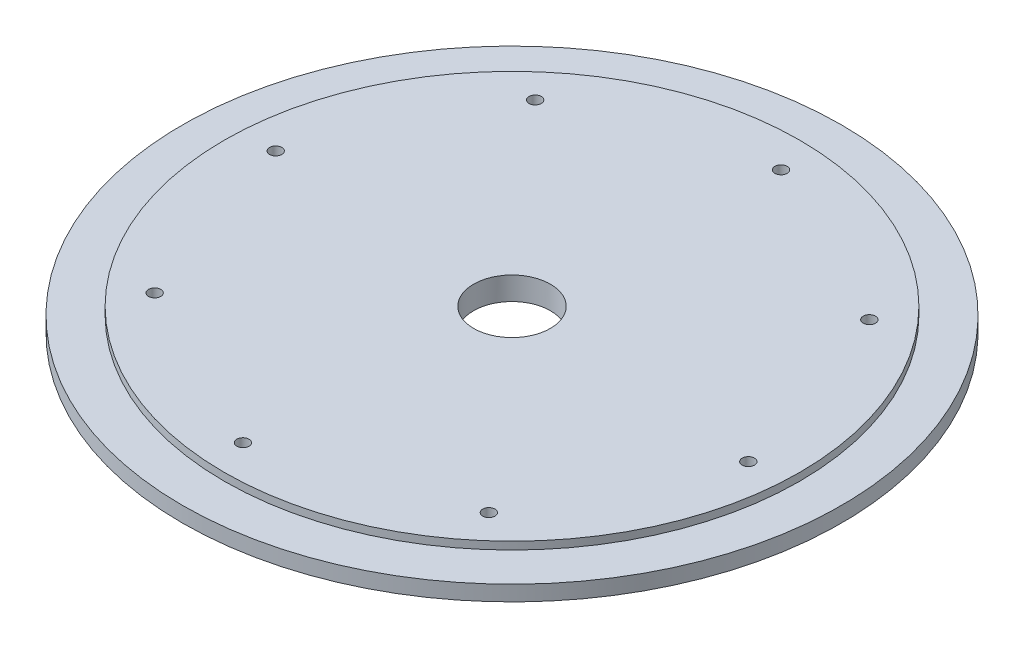
ISO-10303-21;
HEADER;
FILE_DESCRIPTION(('STEP AP214'),'2;1');
FILE_NAME('part.step','',(''),(''),'','','');
FILE_SCHEMA(('AUTOMOTIVE_DESIGN { 1 0 10303 214 1 1 1 1 }'));
ENDSEC;
DATA;
#1=APPLICATION_CONTEXT('core data for automotive mechanical design processes');
#2=APPLICATION_PROTOCOL_DEFINITION('international standard','automotive_design',2000,#1);
#3=PRODUCT_CONTEXT('',#1,'mechanical');
#4=PRODUCT('Part','Part','',(#3));
#5=PRODUCT_RELATED_PRODUCT_CATEGORY('part','',(#4));
#6=PRODUCT_DEFINITION_FORMATION('','',#4);
#7=PRODUCT_DEFINITION_CONTEXT('part definition',#1,'design');
#8=PRODUCT_DEFINITION('design','',#6,#7);
#9=PRODUCT_DEFINITION_SHAPE('','',#8);
#10=(LENGTH_UNIT() NAMED_UNIT(*) SI_UNIT(.MILLI.,.METRE.));
#11=(NAMED_UNIT(*) PLANE_ANGLE_UNIT() SI_UNIT($,.RADIAN.));
#12=(NAMED_UNIT(*) SI_UNIT($,.STERADIAN.) SOLID_ANGLE_UNIT());
#13=UNCERTAINTY_MEASURE_WITH_UNIT(LENGTH_MEASURE(1.E-05),#10,'distance_accuracy_value','');
#14=(GEOMETRIC_REPRESENTATION_CONTEXT(3) GLOBAL_UNCERTAINTY_ASSIGNED_CONTEXT((#13)) GLOBAL_UNIT_ASSIGNED_CONTEXT((#10,
#11,#12)) REPRESENTATION_CONTEXT('',''));
#15=CARTESIAN_POINT('',(0.,0.,0.));
#16=DIRECTION('',(0.,0.,1.));
#17=DIRECTION('',(1.,0.,0.));
#18=AXIS2_PLACEMENT_3D('',#15,#16,#17);
#19=CARTESIAN_POINT('',(0.,1.,0.));
#20=DIRECTION('',(0.,1.,0.));
#21=DIRECTION('',(0.,0.,1.));
#22=AXIS2_PLACEMENT_3D('',#19,#20,#21);
#23=PLANE('',#22);
#24=CARTESIAN_POINT('',(0.,1.,0.));
#25=DIRECTION('',(0.,1.,0.));
#26=DIRECTION('',(0.,0.,1.));
#27=AXIS2_PLACEMENT_3D('',#24,#25,#26);
#28=CIRCLE('',#27,37.5);
#29=CARTESIAN_POINT('',(0.,1.,37.5));
#30=VERTEX_POINT('',#29);
#31=EDGE_CURVE('E11',#30,#30,#28,.T.);
#32=ORIENTED_EDGE('',*,*,#31,.F.);
#33=EDGE_LOOP('',(#32));
#34=FACE_BOUND('',#33,.T.);
#35=CARTESIAN_POINT('',(0.,1.,0.));
#36=DIRECTION('',(0.,1.,0.));
#37=DIRECTION('',(0.,0.,1.));
#38=AXIS2_PLACEMENT_3D('',#35,#36,#37);
#39=CIRCLE('',#38,42.95);
#40=CARTESIAN_POINT('',(0.,1.,42.95));
#41=VERTEX_POINT('',#40);
#42=EDGE_CURVE('E86',#41,#41,#39,.T.);
#43=ORIENTED_EDGE('',*,*,#42,.T.);
#44=EDGE_LOOP('',(#43));
#45=FACE_BOUND('',#44,.T.);
#46=ADVANCED_FACE('F33',(#34,#45),#23,.T.);
#47=CARTESIAN_POINT('',(0.,-1.,0.));
#48=DIRECTION('',(0.,-1.,0.));
#49=DIRECTION('',(0.,0.,-1.));
#50=AXIS2_PLACEMENT_3D('',#47,#48,#49);
#51=PLANE('',#50);
#52=CARTESIAN_POINT('',(32.9309514476961,-1.,2.13364400720492));
#53=DIRECTION('',(0.,-1.,0.));
#54=DIRECTION('',(0.707106781186549,0.,-0.707106781186546));
#55=AXIS2_PLACEMENT_3D('',#52,#53,#54);
#56=CIRCLE('',#55,0.800000000000003);
#57=CARTESIAN_POINT('',(33.4966368726454,-1.,1.56795858225568));
#58=VERTEX_POINT('',#57);
#59=EDGE_CURVE('E58',#58,#58,#56,.T.);
#60=ORIENTED_EDGE('',*,*,#59,.F.);
#61=EDGE_LOOP('',(#60));
#62=FACE_BOUND('',#61,.T.);
#63=CARTESIAN_POINT('',(21.7769849334582,-1.,24.7944132257236));
#64=DIRECTION('',(0.,-1.,0.));
#65=DIRECTION('',(1.,0.,0.));
#66=AXIS2_PLACEMENT_3D('',#63,#64,#65);
#67=CIRCLE('',#66,0.800000000000003);
#68=CARTESIAN_POINT('',(22.5769849334582,-1.,24.7944132257236));
#69=VERTEX_POINT('',#68);
#70=EDGE_CURVE('E166',#69,#69,#67,.T.);
#71=ORIENTED_EDGE('',*,*,#70,.F.);
#72=EDGE_LOOP('',(#71));
#73=FACE_BOUND('',#72,.T.);
#74=CARTESIAN_POINT('',(-2.13364400720503,-1.,32.9309514476961));
#75=DIRECTION('',(0.,-1.,0.));
#76=DIRECTION('',(0.707106781186544,0.,0.707106781186551));
#77=AXIS2_PLACEMENT_3D('',#74,#75,#76);
#78=CIRCLE('',#77,0.800000000000003);
#79=CARTESIAN_POINT('',(-1.5679585822558,-1.,33.4966368726453));
#80=VERTEX_POINT('',#79);
#81=EDGE_CURVE('E169',#80,#80,#78,.T.);
#82=ORIENTED_EDGE('',*,*,#81,.F.);
#83=EDGE_LOOP('',(#82));
#84=FACE_BOUND('',#83,.T.);
#85=CARTESIAN_POINT('',(-24.7944132257235,-1.,21.7769849334583));
#86=DIRECTION('',(0.,-1.,0.));
#87=DIRECTION('',(0.,0.,1.));
#88=AXIS2_PLACEMENT_3D('',#85,#86,#87);
#89=CIRCLE('',#88,0.800000000000003);
#90=CARTESIAN_POINT('',(-24.7944132257235,-1.,22.5769849334583));
#91=VERTEX_POINT('',#90);
#92=EDGE_CURVE('E174',#91,#91,#89,.T.);
#93=ORIENTED_EDGE('',*,*,#92,.F.);
#94=EDGE_LOOP('',(#93));
#95=FACE_BOUND('',#94,.T.);
#96=CARTESIAN_POINT('',(-32.9309514476961,-1.,-2.13364400720515));
#97=DIRECTION('',(0.,-1.,0.));
#98=DIRECTION('',(-0.707106781186554,0.,0.707106781186541));
#99=AXIS2_PLACEMENT_3D('',#96,#97,#98);
#100=CIRCLE('',#99,0.800000000000003);
#101=CARTESIAN_POINT('',(-33.4966368726453,-1.,-1.56795858225591));
#102=VERTEX_POINT('',#101);
#103=EDGE_CURVE('E177',#102,#102,#100,.T.);
#104=ORIENTED_EDGE('',*,*,#103,.F.);
#105=EDGE_LOOP('',(#104));
#106=FACE_BOUND('',#105,.T.);
#107=CARTESIAN_POINT('',(-21.776984933458,-1.,-24.7944132257237));
#108=DIRECTION('',(0.,-1.,0.));
#109=DIRECTION('',(-1.,0.,0.));
#110=AXIS2_PLACEMENT_3D('',#107,#108,#109);
#111=CIRCLE('',#110,0.800000000000003);
#112=CARTESIAN_POINT('',(-22.576984933458,-1.,-24.7944132257237));
#113=VERTEX_POINT('',#112);
#114=EDGE_CURVE('E179',#113,#113,#111,.T.);
#115=ORIENTED_EDGE('',*,*,#114,.F.);
#116=EDGE_LOOP('',(#115));
#117=FACE_BOUND('',#116,.T.);
#118=CARTESIAN_POINT('',(2.13364400720526,-1.,-32.9309514476961));
#119=DIRECTION('',(0.,-1.,0.));
#120=DIRECTION('',(-0.707106781186539,0.,-0.707106781186556));
#121=AXIS2_PLACEMENT_3D('',#118,#119,#120);
#122=CIRCLE('',#121,0.800000000000003);
#123=CARTESIAN_POINT('',(1.56795858225603,-1.,-33.4966368726453));
#124=VERTEX_POINT('',#123);
#125=EDGE_CURVE('E82',#124,#124,#122,.T.);
#126=ORIENTED_EDGE('',*,*,#125,.F.);
#127=EDGE_LOOP('',(#126));
#128=FACE_BOUND('',#127,.T.);
#129=CARTESIAN_POINT('',(24.7944132257235,-1.,-21.7769849334583));
#130=DIRECTION('',(0.,-1.,0.));
#131=DIRECTION('',(0.,0.,-1.));
#132=AXIS2_PLACEMENT_3D('',#129,#130,#131);
#133=CIRCLE('',#132,0.800000000000003);
#134=CARTESIAN_POINT('',(24.7944132257235,-1.,-22.5769849334583));
#135=VERTEX_POINT('',#134);
#136=EDGE_CURVE('E53',#135,#135,#133,.T.);
#137=ORIENTED_EDGE('',*,*,#136,.F.);
#138=EDGE_LOOP('',(#137));
#139=FACE_BOUND('',#138,.T.);
#140=CARTESIAN_POINT('',(0.,-1.,0.));
#141=DIRECTION('',(0.,-1.,0.));
#142=DIRECTION('',(0.,0.,-1.));
#143=AXIS2_PLACEMENT_3D('',#140,#141,#142);
#144=CIRCLE('',#143,5.);
#145=CARTESIAN_POINT('',(0.,-1.,-4.99999999999999));
#146=VERTEX_POINT('',#145);
#147=EDGE_CURVE('E89',#146,#146,#144,.T.);
#148=ORIENTED_EDGE('',*,*,#147,.F.);
#149=EDGE_LOOP('',(#148));
#150=FACE_BOUND('',#149,.T.);
#151=CARTESIAN_POINT('',(0.,-1.,0.));
#152=DIRECTION('',(0.,-1.,0.));
#153=DIRECTION('',(0.,0.,-1.));
#154=AXIS2_PLACEMENT_3D('',#151,#152,#153);
#155=CIRCLE('',#154,42.95);
#156=CARTESIAN_POINT('',(0.,-1.,-42.95));
#157=VERTEX_POINT('',#156);
#158=EDGE_CURVE('E52',#157,#157,#155,.T.);
#159=ORIENTED_EDGE('',*,*,#158,.T.);
#160=EDGE_LOOP('',(#159));
#161=FACE_BOUND('',#160,.T.);
#162=ADVANCED_FACE('F106',(#62,#73,#84,#95,#106,#117,#128,#139,#150,#161),#51,.T.);
#163=CARTESIAN_POINT('',(0.,2.,0.));
#164=DIRECTION('',(0.,-1.,0.));
#165=DIRECTION('',(0.,0.,-1.));
#166=AXIS2_PLACEMENT_3D('',#163,#164,#165);
#167=CYLINDRICAL_SURFACE('',#166,37.5);
#168=CARTESIAN_POINT('',(0.,2.,0.));
#169=DIRECTION('',(0.,1.,0.));
#170=DIRECTION('',(0.,0.,1.));
#171=AXIS2_PLACEMENT_3D('',#168,#169,#170);
#172=CIRCLE('',#171,37.5);
#173=CARTESIAN_POINT('',(0.,2.,37.5));
#174=VERTEX_POINT('',#173);
#175=EDGE_CURVE('E40',#174,#174,#172,.T.);
#176=ORIENTED_EDGE('',*,*,#175,.F.);
#177=EDGE_LOOP('',(#176));
#178=FACE_BOUND('',#177,.T.);
#179=ORIENTED_EDGE('',*,*,#31,.T.);
#180=EDGE_LOOP('',(#179));
#181=FACE_BOUND('',#180,.T.);
#182=ADVANCED_FACE('F100',(#178,#181),#167,.T.);
#183=CARTESIAN_POINT('',(0.,2.,0.));
#184=DIRECTION('',(0.,1.,0.));
#185=DIRECTION('',(0.,0.,1.));
#186=AXIS2_PLACEMENT_3D('',#183,#184,#185);
#187=PLANE('',#186);
#188=CARTESIAN_POINT('',(32.9309514476961,2.,2.13364400720492));
#189=DIRECTION('',(0.,1.,0.));
#190=DIRECTION('',(0.,0.,1.));
#191=AXIS2_PLACEMENT_3D('',#188,#189,#190);
#192=CIRCLE('',#191,0.800000000000003);
#193=CARTESIAN_POINT('',(32.9309514476961,2.,2.93364400720492));
#194=VERTEX_POINT('',#193);
#195=EDGE_CURVE('E36',#194,#194,#192,.T.);
#196=ORIENTED_EDGE('',*,*,#195,.F.);
#197=EDGE_LOOP('',(#196));
#198=FACE_BOUND('',#197,.T.);
#199=CARTESIAN_POINT('',(21.7769849334582,2.,24.7944132257236));
#200=DIRECTION('',(0.,1.,0.));
#201=DIRECTION('',(0.,0.,1.));
#202=AXIS2_PLACEMENT_3D('',#199,#200,#201);
#203=CIRCLE('',#202,0.800000000000003);
#204=CARTESIAN_POINT('',(21.7769849334582,2.,25.5944132257236));
#205=VERTEX_POINT('',#204);
#206=EDGE_CURVE('E69',#205,#205,#203,.T.);
#207=ORIENTED_EDGE('',*,*,#206,.F.);
#208=EDGE_LOOP('',(#207));
#209=FACE_BOUND('',#208,.T.);
#210=CARTESIAN_POINT('',(-2.13364400720503,2.,32.9309514476961));
#211=DIRECTION('',(0.,1.,0.));
#212=DIRECTION('',(0.,0.,1.));
#213=AXIS2_PLACEMENT_3D('',#210,#211,#212);
#214=CIRCLE('',#213,0.800000000000003);
#215=CARTESIAN_POINT('',(-2.13364400720503,2.,33.7309514476961));
#216=VERTEX_POINT('',#215);
#217=EDGE_CURVE('E67',#216,#216,#214,.T.);
#218=ORIENTED_EDGE('',*,*,#217,.F.);
#219=EDGE_LOOP('',(#218));
#220=FACE_BOUND('',#219,.T.);
#221=CARTESIAN_POINT('',(-24.7944132257235,2.,21.7769849334583));
#222=DIRECTION('',(0.,1.,0.));
#223=DIRECTION('',(0.,0.,1.));
#224=AXIS2_PLACEMENT_3D('',#221,#222,#223);
#225=CIRCLE('',#224,0.800000000000003);
#226=CARTESIAN_POINT('',(-24.7944132257235,2.,22.5769849334583));
#227=VERTEX_POINT('',#226);
#228=EDGE_CURVE('E64',#227,#227,#225,.T.);
#229=ORIENTED_EDGE('',*,*,#228,.F.);
#230=EDGE_LOOP('',(#229));
#231=FACE_BOUND('',#230,.T.);
#232=CARTESIAN_POINT('',(-32.9309514476961,2.,-2.13364400720515));
#233=DIRECTION('',(0.,1.,0.));
#234=DIRECTION('',(0.,0.,1.));
#235=AXIS2_PLACEMENT_3D('',#232,#233,#234);
#236=CIRCLE('',#235,0.800000000000003);
#237=CARTESIAN_POINT('',(-32.9309514476961,2.,-1.33364400720515));
#238=VERTEX_POINT('',#237);
#239=EDGE_CURVE('E61',#238,#238,#236,.T.);
#240=ORIENTED_EDGE('',*,*,#239,.F.);
#241=EDGE_LOOP('',(#240));
#242=FACE_BOUND('',#241,.T.);
#243=CARTESIAN_POINT('',(-21.776984933458,2.,-24.7944132257237));
#244=DIRECTION('',(0.,1.,0.));
#245=DIRECTION('',(0.,0.,1.));
#246=AXIS2_PLACEMENT_3D('',#243,#244,#245);
#247=CIRCLE('',#246,0.800000000000003);
#248=CARTESIAN_POINT('',(-21.776984933458,2.,-23.9944132257237));
#249=VERTEX_POINT('',#248);
#250=EDGE_CURVE('E57',#249,#249,#247,.T.);
#251=ORIENTED_EDGE('',*,*,#250,.F.);
#252=EDGE_LOOP('',(#251));
#253=FACE_BOUND('',#252,.T.);
#254=CARTESIAN_POINT('',(2.13364400720526,2.,-32.9309514476961));
#255=DIRECTION('',(0.,1.,0.));
#256=DIRECTION('',(0.,0.,1.));
#257=AXIS2_PLACEMENT_3D('',#254,#255,#256);
#258=CIRCLE('',#257,0.800000000000003);
#259=CARTESIAN_POINT('',(2.13364400720526,2.,-32.1309514476961));
#260=VERTEX_POINT('',#259);
#261=EDGE_CURVE('E54',#260,#260,#258,.T.);
#262=ORIENTED_EDGE('',*,*,#261,.F.);
#263=EDGE_LOOP('',(#262));
#264=FACE_BOUND('',#263,.T.);
#265=CARTESIAN_POINT('',(24.7944132257235,2.,-21.7769849334583));
#266=DIRECTION('',(0.,1.,0.));
#267=DIRECTION('',(0.,0.,1.));
#268=AXIS2_PLACEMENT_3D('',#265,#266,#267);
#269=CIRCLE('',#268,0.800000000000003);
#270=CARTESIAN_POINT('',(24.7944132257235,2.,-20.9769849334583));
#271=VERTEX_POINT('',#270);
#272=EDGE_CURVE('E49',#271,#271,#269,.T.);
#273=ORIENTED_EDGE('',*,*,#272,.F.);
#274=EDGE_LOOP('',(#273));
#275=FACE_BOUND('',#274,.T.);
#276=CARTESIAN_POINT('',(0.,2.,0.));
#277=DIRECTION('',(0.,1.,0.));
#278=DIRECTION('',(0.,0.,1.));
#279=AXIS2_PLACEMENT_3D('',#276,#277,#278);
#280=CIRCLE('',#279,5.);
#281=CARTESIAN_POINT('',(0.,2.,5.));
#282=VERTEX_POINT('',#281);
#283=EDGE_CURVE('E45',#282,#282,#280,.T.);
#284=ORIENTED_EDGE('',*,*,#283,.F.);
#285=EDGE_LOOP('',(#284));
#286=FACE_BOUND('',#285,.T.);
#287=ORIENTED_EDGE('',*,*,#175,.T.);
#288=EDGE_LOOP('',(#287));
#289=FACE_BOUND('',#288,.T.);
#290=ADVANCED_FACE('F97',(#198,#209,#220,#231,#242,#253,#264,#275,#286,#289),#187,.T.);
#291=CARTESIAN_POINT('',(0.,-48.,0.));
#292=DIRECTION('',(0.,1.,0.));
#293=DIRECTION('',(0.,0.,1.));
#294=AXIS2_PLACEMENT_3D('',#291,#292,#293);
#295=CYLINDRICAL_SURFACE('',#294,5.);
#296=ORIENTED_EDGE('',*,*,#283,.T.);
#297=EDGE_LOOP('',(#296));
#298=FACE_BOUND('',#297,.T.);
#299=ORIENTED_EDGE('',*,*,#147,.T.);
#300=EDGE_LOOP('',(#299));
#301=FACE_BOUND('',#300,.T.);
#302=ADVANCED_FACE('F94',(#298,#301),#295,.F.);
#303=CARTESIAN_POINT('',(0.,499.,0.));
#304=DIRECTION('',(0.,-1.,0.));
#305=DIRECTION('',(0.,0.,-1.));
#306=AXIS2_PLACEMENT_3D('',#303,#304,#305);
#307=CYLINDRICAL_SURFACE('',#306,42.95);
#308=ORIENTED_EDGE('',*,*,#42,.F.);
#309=EDGE_LOOP('',(#308));
#310=FACE_BOUND('',#309,.T.);
#311=ORIENTED_EDGE('',*,*,#158,.F.);
#312=EDGE_LOOP('',(#311));
#313=FACE_BOUND('',#312,.T.);
#314=ADVANCED_FACE('F122',(#310,#313),#307,.T.);
#315=CARTESIAN_POINT('',(24.7944132257235,499.,-21.7769849334583));
#316=DIRECTION('',(0.,-1.,0.));
#317=DIRECTION('',(0.,0.,-1.));
#318=AXIS2_PLACEMENT_3D('',#315,#316,#317);
#319=CYLINDRICAL_SURFACE('',#318,0.800000000000003);
#320=ORIENTED_EDGE('',*,*,#272,.T.);
#321=EDGE_LOOP('',(#320));
#322=FACE_BOUND('',#321,.T.);
#323=ORIENTED_EDGE('',*,*,#136,.T.);
#324=EDGE_LOOP('',(#323));
#325=FACE_BOUND('',#324,.T.);
#326=ADVANCED_FACE('F125',(#322,#325),#319,.F.);
#327=CARTESIAN_POINT('',(2.13364400720526,499.,-32.9309514476961));
#328=DIRECTION('',(0.,-1.,0.));
#329=DIRECTION('',(0.,0.,-1.));
#330=AXIS2_PLACEMENT_3D('',#327,#328,#329);
#331=CYLINDRICAL_SURFACE('',#330,0.800000000000003);
#332=ORIENTED_EDGE('',*,*,#261,.T.);
#333=EDGE_LOOP('',(#332));
#334=FACE_BOUND('',#333,.T.);
#335=ORIENTED_EDGE('',*,*,#125,.T.);
#336=EDGE_LOOP('',(#335));
#337=FACE_BOUND('',#336,.T.);
#338=ADVANCED_FACE('F132',(#334,#337),#331,.F.);
#339=CARTESIAN_POINT('',(-21.776984933458,499.,-24.7944132257237));
#340=DIRECTION('',(0.,-1.,0.));
#341=DIRECTION('',(0.,0.,-1.));
#342=AXIS2_PLACEMENT_3D('',#339,#340,#341);
#343=CYLINDRICAL_SURFACE('',#342,0.800000000000003);
#344=ORIENTED_EDGE('',*,*,#250,.T.);
#345=EDGE_LOOP('',(#344));
#346=FACE_BOUND('',#345,.T.);
#347=ORIENTED_EDGE('',*,*,#114,.T.);
#348=EDGE_LOOP('',(#347));
#349=FACE_BOUND('',#348,.T.);
#350=ADVANCED_FACE('F139',(#346,#349),#343,.F.);
#351=CARTESIAN_POINT('',(-32.9309514476961,499.,-2.13364400720515));
#352=DIRECTION('',(0.,-1.,0.));
#353=DIRECTION('',(0.,0.,-1.));
#354=AXIS2_PLACEMENT_3D('',#351,#352,#353);
#355=CYLINDRICAL_SURFACE('',#354,0.800000000000003);
#356=ORIENTED_EDGE('',*,*,#239,.T.);
#357=EDGE_LOOP('',(#356));
#358=FACE_BOUND('',#357,.T.);
#359=ORIENTED_EDGE('',*,*,#103,.T.);
#360=EDGE_LOOP('',(#359));
#361=FACE_BOUND('',#360,.T.);
#362=ADVANCED_FACE('F143',(#358,#361),#355,.F.);
#363=CARTESIAN_POINT('',(-24.7944132257235,499.,21.7769849334583));
#364=DIRECTION('',(0.,-1.,0.));
#365=DIRECTION('',(0.,0.,-1.));
#366=AXIS2_PLACEMENT_3D('',#363,#364,#365);
#367=CYLINDRICAL_SURFACE('',#366,0.800000000000003);
#368=ORIENTED_EDGE('',*,*,#228,.T.);
#369=EDGE_LOOP('',(#368));
#370=FACE_BOUND('',#369,.T.);
#371=ORIENTED_EDGE('',*,*,#92,.T.);
#372=EDGE_LOOP('',(#371));
#373=FACE_BOUND('',#372,.T.);
#374=ADVANCED_FACE('F147',(#370,#373),#367,.F.);
#375=CARTESIAN_POINT('',(-2.13364400720503,499.,32.9309514476961));
#376=DIRECTION('',(0.,-1.,0.));
#377=DIRECTION('',(0.,0.,-1.));
#378=AXIS2_PLACEMENT_3D('',#375,#376,#377);
#379=CYLINDRICAL_SURFACE('',#378,0.800000000000003);
#380=ORIENTED_EDGE('',*,*,#217,.T.);
#381=EDGE_LOOP('',(#380));
#382=FACE_BOUND('',#381,.T.);
#383=ORIENTED_EDGE('',*,*,#81,.T.);
#384=EDGE_LOOP('',(#383));
#385=FACE_BOUND('',#384,.T.);
#386=ADVANCED_FACE('F151',(#382,#385),#379,.F.);
#387=CARTESIAN_POINT('',(21.7769849334582,499.,24.7944132257236));
#388=DIRECTION('',(0.,-1.,0.));
#389=DIRECTION('',(0.,0.,-1.));
#390=AXIS2_PLACEMENT_3D('',#387,#388,#389);
#391=CYLINDRICAL_SURFACE('',#390,0.800000000000003);
#392=ORIENTED_EDGE('',*,*,#206,.T.);
#393=EDGE_LOOP('',(#392));
#394=FACE_BOUND('',#393,.T.);
#395=ORIENTED_EDGE('',*,*,#70,.T.);
#396=EDGE_LOOP('',(#395));
#397=FACE_BOUND('',#396,.T.);
#398=ADVANCED_FACE('F155',(#394,#397),#391,.F.);
#399=CARTESIAN_POINT('',(32.9309514476961,499.,2.13364400720492));
#400=DIRECTION('',(0.,-1.,0.));
#401=DIRECTION('',(0.,0.,-1.));
#402=AXIS2_PLACEMENT_3D('',#399,#400,#401);
#403=CYLINDRICAL_SURFACE('',#402,0.800000000000003);
#404=ORIENTED_EDGE('',*,*,#195,.T.);
#405=EDGE_LOOP('',(#404));
#406=FACE_BOUND('',#405,.T.);
#407=ORIENTED_EDGE('',*,*,#59,.T.);
#408=EDGE_LOOP('',(#407));
#409=FACE_BOUND('',#408,.T.);
#410=ADVANCED_FACE('F159',(#406,#409),#403,.F.);
#411=CLOSED_SHELL('',(#46,#162,#182,#290,#302,#314,#326,#338,#350,#362,#374,#386,#398,#410));
#412=MANIFOLD_SOLID_BREP('B2',#411);
#413=ADVANCED_BREP_SHAPE_REPRESENTATION('',(#18,#412),#14);
#414=SHAPE_DEFINITION_REPRESENTATION(#9,#413);
ENDSEC;
END-ISO-10303-21;
